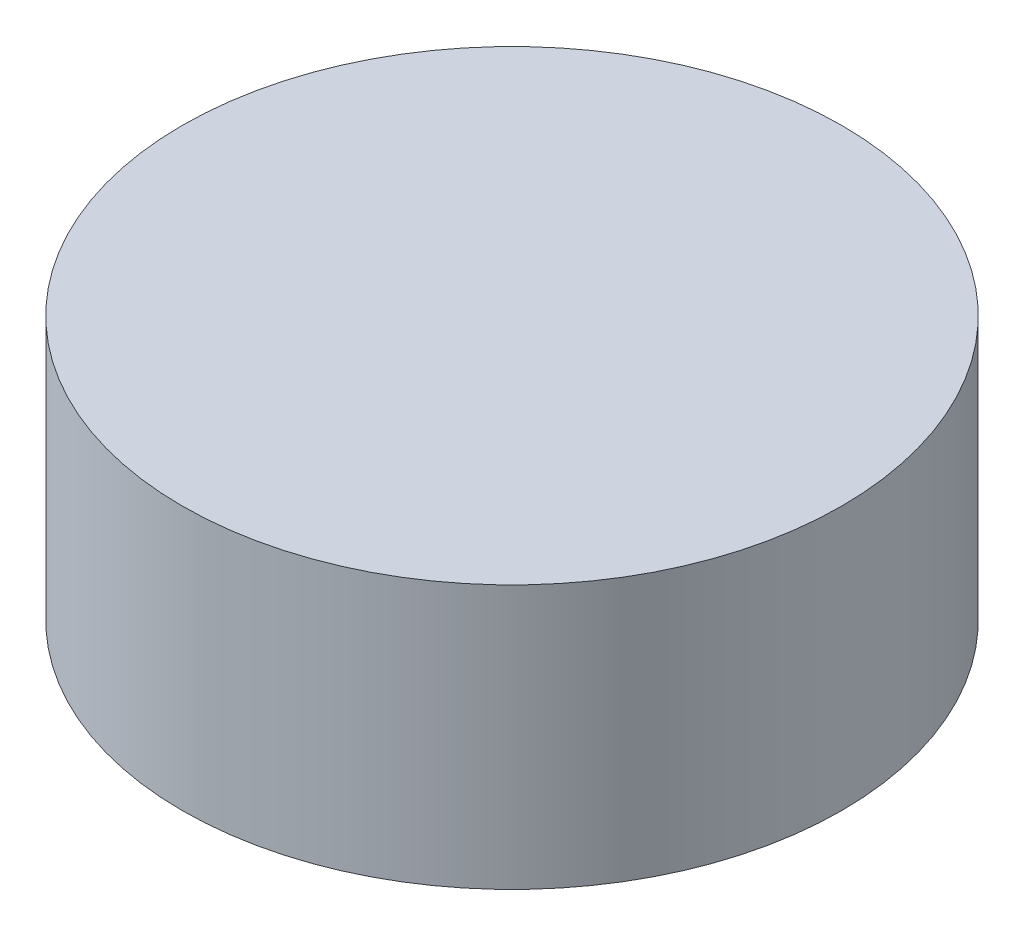
ISO-10303-21;
HEADER;
FILE_DESCRIPTION(('STEP AP214'),'2;1');
FILE_NAME('part.step','',(''),(''),'','','');
FILE_SCHEMA(('AUTOMOTIVE_DESIGN { 1 0 10303 214 1 1 1 1 }'));
ENDSEC;
DATA;
#1=APPLICATION_CONTEXT('core data for automotive mechanical design processes');
#2=APPLICATION_PROTOCOL_DEFINITION('international standard','automotive_design',2000,#1);
#3=PRODUCT_CONTEXT('',#1,'mechanical');
#4=PRODUCT('Part','Part','',(#3));
#5=PRODUCT_RELATED_PRODUCT_CATEGORY('part','',(#4));
#6=PRODUCT_DEFINITION_FORMATION('','',#4);
#7=PRODUCT_DEFINITION_CONTEXT('part definition',#1,'design');
#8=PRODUCT_DEFINITION('design','',#6,#7);
#9=PRODUCT_DEFINITION_SHAPE('','',#8);
#10=(LENGTH_UNIT() NAMED_UNIT(*) SI_UNIT(.MILLI.,.METRE.));
#11=(NAMED_UNIT(*) PLANE_ANGLE_UNIT() SI_UNIT($,.RADIAN.));
#12=(NAMED_UNIT(*) SI_UNIT($,.STERADIAN.) SOLID_ANGLE_UNIT());
#13=UNCERTAINTY_MEASURE_WITH_UNIT(LENGTH_MEASURE(1.E-05),#10,'distance_accuracy_value','');
#14=(GEOMETRIC_REPRESENTATION_CONTEXT(3) GLOBAL_UNCERTAINTY_ASSIGNED_CONTEXT((#13)) GLOBAL_UNIT_ASSIGNED_CONTEXT((#10,
#11,#12)) REPRESENTATION_CONTEXT('',''));
#15=CARTESIAN_POINT('',(0.,0.,0.));
#16=DIRECTION('',(0.,0.,1.));
#17=DIRECTION('',(1.,0.,0.));
#18=AXIS2_PLACEMENT_3D('',#15,#16,#17);
#19=CARTESIAN_POINT('',(0.,2.,0.));
#20=DIRECTION('',(0.,-1.,0.));
#21=DIRECTION('',(0.,0.,-1.));
#22=AXIS2_PLACEMENT_3D('',#19,#20,#21);
#23=CYLINDRICAL_SURFACE('',#22,2.5);
#24=CARTESIAN_POINT('',(0.,2.,0.));
#25=DIRECTION('',(0.,1.,0.));
#26=DIRECTION('',(0.,0.,1.));
#27=AXIS2_PLACEMENT_3D('',#24,#25,#26);
#28=CIRCLE('',#27,2.5);
#29=CARTESIAN_POINT('',(0.,2.,2.5));
#30=VERTEX_POINT('',#29);
#31=EDGE_CURVE('E10',#30,#30,#28,.T.);
#32=ORIENTED_EDGE('',*,*,#31,.F.);
#33=EDGE_LOOP('',(#32));
#34=FACE_BOUND('',#33,.T.);
#35=CARTESIAN_POINT('',(0.,0.,0.));
#36=DIRECTION('',(0.,1.,0.));
#37=DIRECTION('',(0.,0.,1.));
#38=AXIS2_PLACEMENT_3D('',#35,#36,#37);
#39=CIRCLE('',#38,2.5);
#40=CARTESIAN_POINT('',(0.,0.,2.5));
#41=VERTEX_POINT('',#40);
#42=EDGE_CURVE('E33',#41,#41,#39,.T.);
#43=ORIENTED_EDGE('',*,*,#42,.T.);
#44=EDGE_LOOP('',(#43));
#45=FACE_BOUND('',#44,.T.);
#46=ADVANCED_FACE('F30',(#34,#45),#23,.T.);
#47=CARTESIAN_POINT('',(0.,2.,0.));
#48=DIRECTION('',(0.,1.,0.));
#49=DIRECTION('',(0.,0.,1.));
#50=AXIS2_PLACEMENT_3D('',#47,#48,#49);
#51=PLANE('',#50);
#52=ORIENTED_EDGE('',*,*,#31,.T.);
#53=EDGE_LOOP('',(#52));
#54=FACE_BOUND('',#53,.T.);
#55=ADVANCED_FACE('F45',(#54),#51,.T.);
#56=CARTESIAN_POINT('',(0.,0.,0.));
#57=DIRECTION('',(0.,1.,0.));
#58=DIRECTION('',(0.,0.,1.));
#59=AXIS2_PLACEMENT_3D('',#56,#57,#58);
#60=PLANE('',#59);
#61=ORIENTED_EDGE('',*,*,#42,.F.);
#62=EDGE_LOOP('',(#61));
#63=FACE_BOUND('',#62,.T.);
#64=ADVANCED_FACE('F43',(#63),#60,.F.);
#65=CLOSED_SHELL('',(#46,#55,#64));
#66=MANIFOLD_SOLID_BREP('B2',#65);
#67=ADVANCED_BREP_SHAPE_REPRESENTATION('',(#18,#66),#14);
#68=SHAPE_DEFINITION_REPRESENTATION(#9,#67);
ENDSEC;
END-ISO-10303-21;
